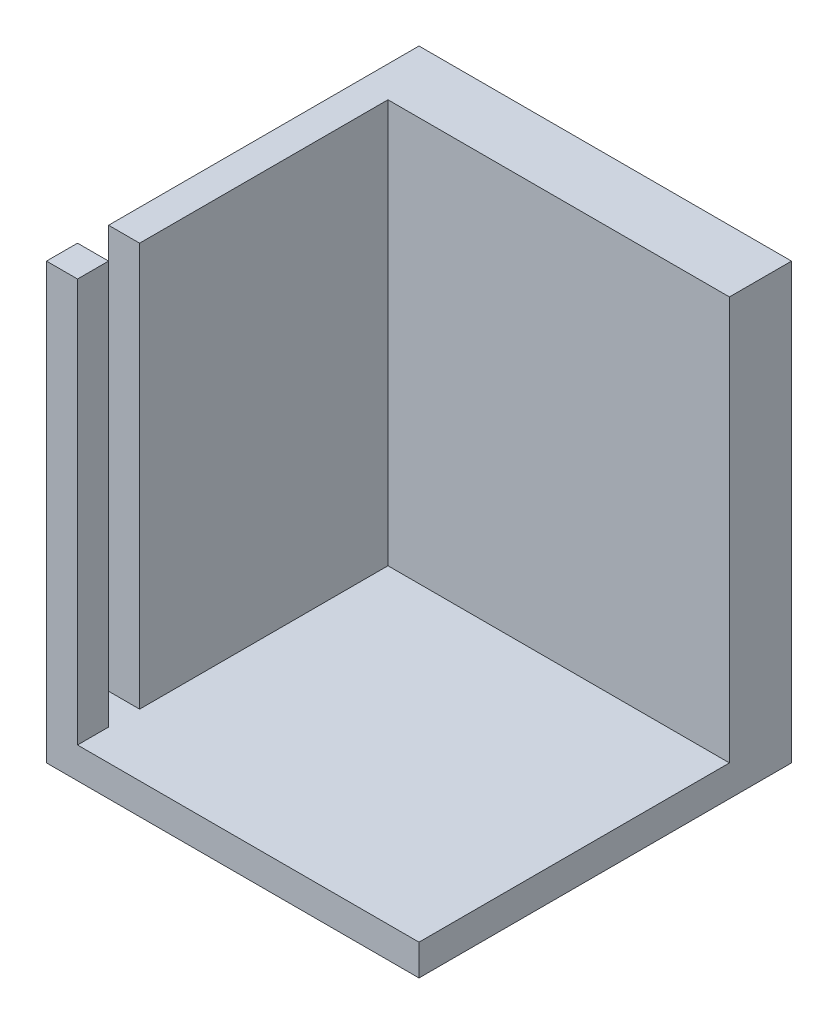
ISO-10303-21;
HEADER;
FILE_DESCRIPTION(('STEP AP214'),'2;1');
FILE_NAME('part.step','',(''),(''),'','','');
FILE_SCHEMA(('AUTOMOTIVE_DESIGN { 1 0 10303 214 1 1 1 1 }'));
ENDSEC;
DATA;
#1=APPLICATION_CONTEXT('core data for automotive mechanical design processes');
#2=APPLICATION_PROTOCOL_DEFINITION('international standard','automotive_design',2000,#1);
#3=PRODUCT_CONTEXT('',#1,'mechanical');
#4=PRODUCT('Part','Part','',(#3));
#5=PRODUCT_RELATED_PRODUCT_CATEGORY('part','',(#4));
#6=PRODUCT_DEFINITION_FORMATION('','',#4);
#7=PRODUCT_DEFINITION_CONTEXT('part definition',#1,'design');
#8=PRODUCT_DEFINITION('design','',#6,#7);
#9=PRODUCT_DEFINITION_SHAPE('','',#8);
#10=(LENGTH_UNIT() NAMED_UNIT(*) SI_UNIT(.MILLI.,.METRE.));
#11=(NAMED_UNIT(*) PLANE_ANGLE_UNIT() SI_UNIT($,.RADIAN.));
#12=(NAMED_UNIT(*) SI_UNIT($,.STERADIAN.) SOLID_ANGLE_UNIT());
#13=UNCERTAINTY_MEASURE_WITH_UNIT(LENGTH_MEASURE(1.E-05),#10,'distance_accuracy_value','');
#14=(GEOMETRIC_REPRESENTATION_CONTEXT(3) GLOBAL_UNCERTAINTY_ASSIGNED_CONTEXT((#13)) GLOBAL_UNIT_ASSIGNED_CONTEXT((#10,
#11,#12)) REPRESENTATION_CONTEXT('',''));
#15=CARTESIAN_POINT('',(0.,0.,0.));
#16=DIRECTION('',(0.,0.,1.));
#17=DIRECTION('',(1.,0.,0.));
#18=AXIS2_PLACEMENT_3D('',#15,#16,#17);
#19=CARTESIAN_POINT('',(0.,530.,0.));
#20=DIRECTION('',(0.,0.,-1.));
#21=DIRECTION('',(-1.,0.,0.));
#22=AXIS2_PLACEMENT_3D('',#19,#20,#21);
#23=PLANE('',#22);
#24=DIRECTION('',(0.,-1.,0.));
#25=VECTOR('',#24,1.);
#26=CARTESIAN_POINT('',(9.99999999999982,10.,0.));
#27=LINE('',#26,#25);
#28=CARTESIAN_POINT('',(9.99999999999982,140.,0.));
#29=VERTEX_POINT('',#28);
#30=CARTESIAN_POINT('',(9.99999999999982,10.,0.));
#31=VERTEX_POINT('',#30);
#32=EDGE_CURVE('E136',#29,#31,#27,.T.);
#33=ORIENTED_EDGE('',*,*,#32,.F.);
#34=DIRECTION('',(1.,0.,0.));
#35=VECTOR('',#34,1.);
#36=CARTESIAN_POINT('',(0.,140.,0.));
#37=LINE('',#36,#35);
#38=CARTESIAN_POINT('',(0.,140.,0.));
#39=VERTEX_POINT('',#38);
#40=EDGE_CURVE('E122',#39,#29,#37,.T.);
#41=ORIENTED_EDGE('',*,*,#40,.F.);
#42=DIRECTION('',(0.,-1.,0.));
#43=VECTOR('',#42,1.);
#44=CARTESIAN_POINT('',(0.,530.,0.));
#45=LINE('',#44,#43);
#46=CARTESIAN_POINT('',(0.,0.,0.));
#47=VERTEX_POINT('',#46);
#48=EDGE_CURVE('E11',#39,#47,#45,.T.);
#49=ORIENTED_EDGE('',*,*,#48,.T.);
#50=DIRECTION('',(1.,0.,0.));
#51=VECTOR('',#50,1.);
#52=CARTESIAN_POINT('',(0.,0.,0.));
#53=LINE('',#52,#51);
#54=CARTESIAN_POINT('',(120.,0.,0.));
#55=VERTEX_POINT('',#54);
#56=EDGE_CURVE('E148',#47,#55,#53,.T.);
#57=ORIENTED_EDGE('',*,*,#56,.T.);
#58=DIRECTION('',(0.,1.,0.));
#59=VECTOR('',#58,1.);
#60=CARTESIAN_POINT('',(120.,0.,0.));
#61=LINE('',#60,#59);
#62=CARTESIAN_POINT('',(120.,10.,0.));
#63=VERTEX_POINT('',#62);
#64=EDGE_CURVE('E176',#55,#63,#61,.T.);
#65=ORIENTED_EDGE('',*,*,#64,.T.);
#66=DIRECTION('',(1.,0.,0.));
#67=VECTOR('',#66,1.);
#68=CARTESIAN_POINT('',(9.99999999999982,10.,0.));
#69=LINE('',#68,#67);
#70=EDGE_CURVE('E178',#31,#63,#69,.T.);
#71=ORIENTED_EDGE('',*,*,#70,.F.);
#72=EDGE_LOOP('',(#33,#41,#49,#57,#65,#71));
#73=FACE_BOUND('',#72,.T.);
#74=ADVANCED_FACE('F38',(#73),#23,.F.);
#75=CARTESIAN_POINT('',(0.,530.,-120.));
#76=DIRECTION('',(0.,0.,1.));
#77=DIRECTION('',(1.,0.,0.));
#78=AXIS2_PLACEMENT_3D('',#75,#76,#77);
#79=PLANE('',#78);
#80=DIRECTION('',(0.,-1.,0.));
#81=VECTOR('',#80,1.);
#82=CARTESIAN_POINT('',(0.,530.,-120.));
#83=LINE('',#82,#81);
#84=CARTESIAN_POINT('',(0.,140.,-120.));
#85=VERTEX_POINT('',#84);
#86=CARTESIAN_POINT('',(0.,0.,-120.));
#87=VERTEX_POINT('',#86);
#88=EDGE_CURVE('E47',#85,#87,#83,.T.);
#89=ORIENTED_EDGE('',*,*,#88,.F.);
#90=DIRECTION('',(1.,0.,0.));
#91=VECTOR('',#90,1.);
#92=CARTESIAN_POINT('',(0.,140.,-120.));
#93=LINE('',#92,#91);
#94=CARTESIAN_POINT('',(120.,140.,-120.));
#95=VERTEX_POINT('',#94);
#96=EDGE_CURVE('E129',#85,#95,#93,.T.);
#97=ORIENTED_EDGE('',*,*,#96,.T.);
#98=DIRECTION('',(0.,1.,0.));
#99=VECTOR('',#98,1.);
#100=CARTESIAN_POINT('',(120.,0.,-120.));
#101=LINE('',#100,#99);
#102=CARTESIAN_POINT('',(120.,0.,-120.));
#103=VERTEX_POINT('',#102);
#104=EDGE_CURVE('E167',#103,#95,#101,.T.);
#105=ORIENTED_EDGE('',*,*,#104,.F.);
#106=DIRECTION('',(-1.,0.,0.));
#107=VECTOR('',#106,1.);
#108=CARTESIAN_POINT('',(0.,0.,-120.));
#109=LINE('',#108,#107);
#110=EDGE_CURVE('E153',#103,#87,#109,.T.);
#111=ORIENTED_EDGE('',*,*,#110,.T.);
#112=EDGE_LOOP('',(#89,#97,#105,#111));
#113=FACE_BOUND('',#112,.T.);
#114=ADVANCED_FACE('F164',(#113),#79,.F.);
#115=CARTESIAN_POINT('',(0.,0.,0.));
#116=DIRECTION('',(0.,-1.,0.));
#117=DIRECTION('',(0.,0.,-1.));
#118=AXIS2_PLACEMENT_3D('',#115,#116,#117);
#119=PLANE('',#118);
#120=ORIENTED_EDGE('',*,*,#110,.F.);
#121=DIRECTION('',(0.,0.,1.));
#122=VECTOR('',#121,1.);
#123=CARTESIAN_POINT('',(120.,0.,-120.));
#124=LINE('',#123,#122);
#125=EDGE_CURVE('E170',#103,#55,#124,.T.);
#126=ORIENTED_EDGE('',*,*,#125,.T.);
#127=ORIENTED_EDGE('',*,*,#56,.F.);
#128=DIRECTION('',(0.,0.,1.));
#129=VECTOR('',#128,1.);
#130=CARTESIAN_POINT('',(0.,0.,0.));
#131=LINE('',#130,#129);
#132=EDGE_CURVE('E141',#87,#47,#131,.T.);
#133=ORIENTED_EDGE('',*,*,#132,.F.);
#134=EDGE_LOOP('',(#120,#126,#127,#133));
#135=FACE_BOUND('',#134,.T.);
#136=ADVANCED_FACE('F169',(#135),#119,.T.);
#137=CARTESIAN_POINT('',(9.99999999999982,10.,-100.));
#138=DIRECTION('',(0.,-1.,0.));
#139=DIRECTION('',(0.,0.,-1.));
#140=AXIS2_PLACEMENT_3D('',#137,#138,#139);
#141=PLANE('',#140);
#142=DIRECTION('',(0.,0.,1.));
#143=VECTOR('',#142,1.);
#144=CARTESIAN_POINT('',(120.,10.,-100.));
#145=LINE('',#144,#143);
#146=CARTESIAN_POINT('',(120.,10.,-100.));
#147=VERTEX_POINT('',#146);
#148=EDGE_CURVE('E186',#147,#63,#145,.T.);
#149=ORIENTED_EDGE('',*,*,#148,.F.);
#150=DIRECTION('',(1.,0.,0.));
#151=VECTOR('',#150,1.);
#152=CARTESIAN_POINT('',(9.99999999999982,10.,-100.));
#153=LINE('',#152,#151);
#154=CARTESIAN_POINT('',(9.99999999999982,10.,-100.));
#155=VERTEX_POINT('',#154);
#156=EDGE_CURVE('E193',#155,#147,#153,.T.);
#157=ORIENTED_EDGE('',*,*,#156,.F.);
#158=DIRECTION('',(0.,0.,1.));
#159=VECTOR('',#158,1.);
#160=CARTESIAN_POINT('',(9.99999999999982,10.,-100.));
#161=LINE('',#160,#159);
#162=CARTESIAN_POINT('',(9.99999999999983,10.,-20.));
#163=VERTEX_POINT('',#162);
#164=EDGE_CURVE('E149',#155,#163,#161,.T.);
#165=ORIENTED_EDGE('',*,*,#164,.T.);
#166=DIRECTION('',(1.,0.,0.));
#167=VECTOR('',#166,1.);
#168=CARTESIAN_POINT('',(-47.0000000000002,10.,-20.));
#169=LINE('',#168,#167);
#170=CARTESIAN_POINT('',(0.,10.,-20.));
#171=VERTEX_POINT('',#170);
#172=EDGE_CURVE('E217',#171,#163,#169,.T.);
#173=ORIENTED_EDGE('',*,*,#172,.F.);
#174=DIRECTION('',(0.,0.,-1.));
#175=VECTOR('',#174,1.);
#176=CARTESIAN_POINT('',(0.,10.,0.));
#177=LINE('',#176,#175);
#178=CARTESIAN_POINT('',(0.,10.,-10.));
#179=VERTEX_POINT('',#178);
#180=EDGE_CURVE('E195',#179,#171,#177,.T.);
#181=ORIENTED_EDGE('',*,*,#180,.F.);
#182=DIRECTION('',(1.,0.,0.));
#183=VECTOR('',#182,1.);
#184=CARTESIAN_POINT('',(-47.0000000000002,10.,-10.));
#185=LINE('',#184,#183);
#186=CARTESIAN_POINT('',(9.99999999999982,10.,-9.99999999999999));
#187=VERTEX_POINT('',#186);
#188=EDGE_CURVE('E218',#179,#187,#185,.T.);
#189=ORIENTED_EDGE('',*,*,#188,.T.);
#190=EDGE_CURVE('E156',#187,#31,#161,.T.);
#191=ORIENTED_EDGE('',*,*,#190,.T.);
#192=ORIENTED_EDGE('',*,*,#70,.T.);
#193=EDGE_LOOP('',(#149,#157,#165,#173,#181,#189,#191,#192));
#194=FACE_BOUND('',#193,.T.);
#195=ADVANCED_FACE('F184',(#194),#141,.F.);
#196=CARTESIAN_POINT('',(0.,0.,-100.));
#197=DIRECTION('',(0.,0.,-1.));
#198=DIRECTION('',(-1.,0.,0.));
#199=AXIS2_PLACEMENT_3D('',#196,#197,#198);
#200=PLANE('',#199);
#201=DIRECTION('',(0.,-1.,0.));
#202=VECTOR('',#201,1.);
#203=CARTESIAN_POINT('',(120.,0.,-100.));
#204=LINE('',#203,#202);
#205=CARTESIAN_POINT('',(120.,140.,-100.));
#206=VERTEX_POINT('',#205);
#207=EDGE_CURVE('E173',#206,#147,#204,.T.);
#208=ORIENTED_EDGE('',*,*,#207,.F.);
#209=DIRECTION('',(-1.,0.,0.));
#210=VECTOR('',#209,1.);
#211=CARTESIAN_POINT('',(0.,140.,-100.));
#212=LINE('',#211,#210);
#213=CARTESIAN_POINT('',(9.99999999999982,140.,-100.));
#214=VERTEX_POINT('',#213);
#215=EDGE_CURVE('E62',#206,#214,#212,.T.);
#216=ORIENTED_EDGE('',*,*,#215,.T.);
#217=DIRECTION('',(0.,-1.,0.));
#218=VECTOR('',#217,1.);
#219=CARTESIAN_POINT('',(9.99999999999982,10.,-100.));
#220=LINE('',#219,#218);
#221=EDGE_CURVE('E190',#214,#155,#220,.T.);
#222=ORIENTED_EDGE('',*,*,#221,.T.);
#223=ORIENTED_EDGE('',*,*,#156,.T.);
#224=EDGE_LOOP('',(#208,#216,#222,#223));
#225=FACE_BOUND('',#224,.T.);
#226=ADVANCED_FACE('F252',(#225),#200,.F.);
#227=CARTESIAN_POINT('',(9.99999999999982,10.,-100.));
#228=DIRECTION('',(-1.,0.,0.));
#229=DIRECTION('',(0.,0.,1.));
#230=AXIS2_PLACEMENT_3D('',#227,#228,#229);
#231=PLANE('',#230);
#232=DIRECTION('',(0.,1.,0.));
#233=VECTOR('',#232,1.);
#234=CARTESIAN_POINT('',(9.99999999999982,10.,-9.99999999999999));
#235=LINE('',#234,#233);
#236=CARTESIAN_POINT('',(9.99999999999982,140.,-9.99999999999999));
#237=VERTEX_POINT('',#236);
#238=EDGE_CURVE('E206',#187,#237,#235,.T.);
#239=ORIENTED_EDGE('',*,*,#238,.T.);
#240=DIRECTION('',(0.,0.,1.));
#241=VECTOR('',#240,1.);
#242=CARTESIAN_POINT('',(9.99999999999982,140.,-100.));
#243=LINE('',#242,#241);
#244=EDGE_CURVE('E54',#237,#29,#243,.T.);
#245=ORIENTED_EDGE('',*,*,#244,.T.);
#246=ORIENTED_EDGE('',*,*,#32,.T.);
#247=ORIENTED_EDGE('',*,*,#190,.F.);
#248=EDGE_LOOP('',(#239,#245,#246,#247));
#249=FACE_BOUND('',#248,.T.);
#250=ADVANCED_FACE('F267',(#249),#231,.F.);
#251=CARTESIAN_POINT('',(0.,530.,0.));
#252=DIRECTION('',(1.,0.,0.));
#253=DIRECTION('',(0.,0.,-1.));
#254=AXIS2_PLACEMENT_3D('',#251,#252,#253);
#255=PLANE('',#254);
#256=ORIENTED_EDGE('',*,*,#48,.F.);
#257=DIRECTION('',(0.,0.,1.));
#258=VECTOR('',#257,1.);
#259=CARTESIAN_POINT('',(0.,140.,-120.));
#260=LINE('',#259,#258);
#261=CARTESIAN_POINT('',(0.,140.,-9.99999999999999));
#262=VERTEX_POINT('',#261);
#263=EDGE_CURVE('E119',#262,#39,#260,.T.);
#264=ORIENTED_EDGE('',*,*,#263,.F.);
#265=DIRECTION('',(0.,-1.,0.));
#266=VECTOR('',#265,1.);
#267=CARTESIAN_POINT('',(0.,530.,-10.));
#268=LINE('',#267,#266);
#269=EDGE_CURVE('E203',#262,#179,#268,.T.);
#270=ORIENTED_EDGE('',*,*,#269,.T.);
#271=ORIENTED_EDGE('',*,*,#180,.T.);
#272=DIRECTION('',(0.,1.,0.));
#273=VECTOR('',#272,1.);
#274=CARTESIAN_POINT('',(0.,530.,-20.));
#275=LINE('',#274,#273);
#276=CARTESIAN_POINT('',(0.,140.,-20.));
#277=VERTEX_POINT('',#276);
#278=EDGE_CURVE('E210',#171,#277,#275,.T.);
#279=ORIENTED_EDGE('',*,*,#278,.T.);
#280=EDGE_CURVE('E128',#85,#277,#260,.T.);
#281=ORIENTED_EDGE('',*,*,#280,.F.);
#282=ORIENTED_EDGE('',*,*,#88,.T.);
#283=ORIENTED_EDGE('',*,*,#132,.T.);
#284=EDGE_LOOP('',(#256,#264,#270,#271,#279,#281,#282,#283));
#285=FACE_BOUND('',#284,.T.);
#286=ADVANCED_FACE('F40',(#285),#255,.F.);
#287=ORIENTED_EDGE('',*,*,#221,.F.);
#288=DIRECTION('',(0.,0.,1.));
#289=VECTOR('',#288,1.);
#290=CARTESIAN_POINT('',(9.99999999999982,140.,-100.));
#291=LINE('',#290,#289);
#292=CARTESIAN_POINT('',(9.99999999999983,140.,-20.));
#293=VERTEX_POINT('',#292);
#294=EDGE_CURVE('E236',#214,#293,#291,.T.);
#295=ORIENTED_EDGE('',*,*,#294,.T.);
#296=DIRECTION('',(0.,-1.,0.));
#297=VECTOR('',#296,1.);
#298=CARTESIAN_POINT('',(9.99999999999982,10.,-20.));
#299=LINE('',#298,#297);
#300=EDGE_CURVE('E214',#293,#163,#299,.T.);
#301=ORIENTED_EDGE('',*,*,#300,.T.);
#302=ORIENTED_EDGE('',*,*,#164,.F.);
#303=EDGE_LOOP('',(#287,#295,#301,#302));
#304=FACE_BOUND('',#303,.T.);
#305=ADVANCED_FACE('F258',(#304),#231,.F.);
#306=CARTESIAN_POINT('',(-47.0000000000002,10.,-10.));
#307=DIRECTION('',(0.,0.,1.));
#308=DIRECTION('',(1.,0.,0.));
#309=AXIS2_PLACEMENT_3D('',#306,#307,#308);
#310=PLANE('',#309);
#311=ORIENTED_EDGE('',*,*,#269,.F.);
#312=DIRECTION('',(1.,0.,0.));
#313=VECTOR('',#312,1.);
#314=CARTESIAN_POINT('',(-47.0000000000002,140.,-10.));
#315=LINE('',#314,#313);
#316=EDGE_CURVE('E123',#262,#237,#315,.T.);
#317=ORIENTED_EDGE('',*,*,#316,.T.);
#318=ORIENTED_EDGE('',*,*,#238,.F.);
#319=ORIENTED_EDGE('',*,*,#188,.F.);
#320=EDGE_LOOP('',(#311,#317,#318,#319));
#321=FACE_BOUND('',#320,.T.);
#322=ADVANCED_FACE('F265',(#321),#310,.F.);
#323=CARTESIAN_POINT('',(-47.0000000000002,10.,-20.));
#324=DIRECTION('',(0.,0.,-1.));
#325=DIRECTION('',(-1.,0.,0.));
#326=AXIS2_PLACEMENT_3D('',#323,#324,#325);
#327=PLANE('',#326);
#328=ORIENTED_EDGE('',*,*,#300,.F.);
#329=DIRECTION('',(-1.,0.,0.));
#330=VECTOR('',#329,1.);
#331=CARTESIAN_POINT('',(-47.0000000000002,140.,-20.));
#332=LINE('',#331,#330);
#333=EDGE_CURVE('E240',#293,#277,#332,.T.);
#334=ORIENTED_EDGE('',*,*,#333,.T.);
#335=ORIENTED_EDGE('',*,*,#278,.F.);
#336=ORIENTED_EDGE('',*,*,#172,.T.);
#337=EDGE_LOOP('',(#328,#334,#335,#336));
#338=FACE_BOUND('',#337,.T.);
#339=ADVANCED_FACE('F261',(#338),#327,.F.);
#340=CARTESIAN_POINT('',(120.,0.,-120.));
#341=DIRECTION('',(1.,0.,0.));
#342=DIRECTION('',(0.,0.,-1.));
#343=AXIS2_PLACEMENT_3D('',#340,#341,#342);
#344=PLANE('',#343);
#345=DIRECTION('',(0.,0.,1.));
#346=VECTOR('',#345,1.);
#347=CARTESIAN_POINT('',(120.,140.,-120.));
#348=LINE('',#347,#346);
#349=EDGE_CURVE('E243',#95,#206,#348,.T.);
#350=ORIENTED_EDGE('',*,*,#349,.T.);
#351=ORIENTED_EDGE('',*,*,#207,.T.);
#352=ORIENTED_EDGE('',*,*,#148,.T.);
#353=ORIENTED_EDGE('',*,*,#64,.F.);
#354=ORIENTED_EDGE('',*,*,#125,.F.);
#355=ORIENTED_EDGE('',*,*,#104,.T.);
#356=EDGE_LOOP('',(#350,#351,#352,#353,#354,#355));
#357=FACE_BOUND('',#356,.T.);
#358=ADVANCED_FACE('F249',(#357),#344,.T.);
#359=CARTESIAN_POINT('',(0.,140.,-120.));
#360=DIRECTION('',(0.,-1.,0.));
#361=DIRECTION('',(0.,0.,-1.));
#362=AXIS2_PLACEMENT_3D('',#359,#360,#361);
#363=PLANE('',#362);
#364=ORIENTED_EDGE('',*,*,#349,.F.);
#365=ORIENTED_EDGE('',*,*,#96,.F.);
#366=ORIENTED_EDGE('',*,*,#280,.T.);
#367=ORIENTED_EDGE('',*,*,#333,.F.);
#368=ORIENTED_EDGE('',*,*,#294,.F.);
#369=ORIENTED_EDGE('',*,*,#215,.F.);
#370=EDGE_LOOP('',(#364,#365,#366,#367,#368,#369));
#371=FACE_BOUND('',#370,.T.);
#372=ADVANCED_FACE('F299',(#371),#363,.F.);
#373=ORIENTED_EDGE('',*,*,#316,.F.);
#374=ORIENTED_EDGE('',*,*,#263,.T.);
#375=ORIENTED_EDGE('',*,*,#40,.T.);
#376=ORIENTED_EDGE('',*,*,#244,.F.);
#377=EDGE_LOOP('',(#373,#374,#375,#376));
#378=FACE_BOUND('',#377,.T.);
#379=ADVANCED_FACE('F121',(#378),#363,.F.);
#380=CLOSED_SHELL('',(#74,#114,#136,#195,#226,#250,#286,#305,#322,#339,#358,#372,#379));
#381=MANIFOLD_SOLID_BREP('B2',#380);
#382=ADVANCED_BREP_SHAPE_REPRESENTATION('',(#18,#381),#14);
#383=SHAPE_DEFINITION_REPRESENTATION(#9,#382);
ENDSEC;
END-ISO-10303-21;
